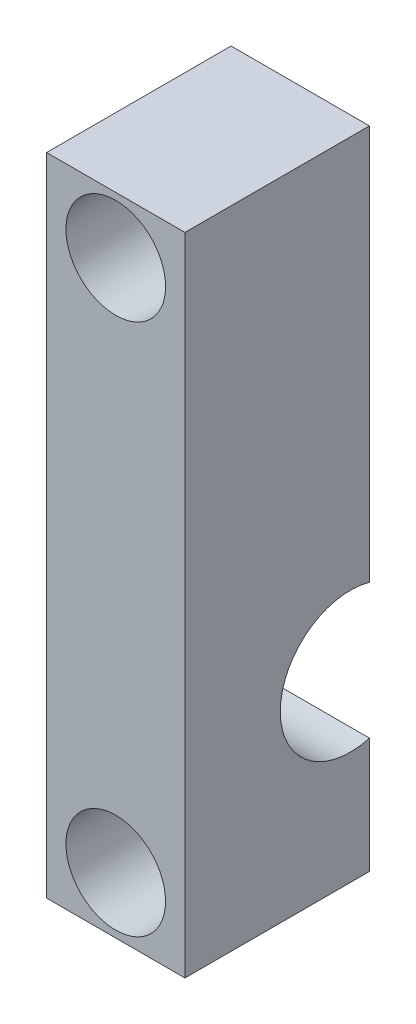
ISO-10303-21;
HEADER;
FILE_DESCRIPTION(('STEP AP214'),'2;1');
FILE_NAME('part.step','',(''),(''),'','','');
FILE_SCHEMA(('AUTOMOTIVE_DESIGN { 1 0 10303 214 1 1 1 1 }'));
ENDSEC;
DATA;
#1=APPLICATION_CONTEXT('core data for automotive mechanical design processes');
#2=APPLICATION_PROTOCOL_DEFINITION('international standard','automotive_design',2000,#1);
#3=PRODUCT_CONTEXT('',#1,'mechanical');
#4=PRODUCT('Part','Part','',(#3));
#5=PRODUCT_RELATED_PRODUCT_CATEGORY('part','',(#4));
#6=PRODUCT_DEFINITION_FORMATION('','',#4);
#7=PRODUCT_DEFINITION_CONTEXT('part definition',#1,'design');
#8=PRODUCT_DEFINITION('design','',#6,#7);
#9=PRODUCT_DEFINITION_SHAPE('','',#8);
#10=(LENGTH_UNIT() NAMED_UNIT(*) SI_UNIT(.MILLI.,.METRE.));
#11=(NAMED_UNIT(*) PLANE_ANGLE_UNIT() SI_UNIT($,.RADIAN.));
#12=(NAMED_UNIT(*) SI_UNIT($,.STERADIAN.) SOLID_ANGLE_UNIT());
#13=UNCERTAINTY_MEASURE_WITH_UNIT(LENGTH_MEASURE(1.E-05),#10,'distance_accuracy_value','');
#14=(GEOMETRIC_REPRESENTATION_CONTEXT(3) GLOBAL_UNCERTAINTY_ASSIGNED_CONTEXT((#13)) GLOBAL_UNIT_ASSIGNED_CONTEXT((#10,
#11,#12)) REPRESENTATION_CONTEXT('',''));
#15=CARTESIAN_POINT('',(0.,0.,0.));
#16=DIRECTION('',(0.,0.,1.));
#17=DIRECTION('',(1.,0.,0.));
#18=AXIS2_PLACEMENT_3D('',#15,#16,#17);
#19=CARTESIAN_POINT('',(0.,0.,0.));
#20=DIRECTION('',(0.,0.,1.));
#21=DIRECTION('',(1.,0.,0.));
#22=AXIS2_PLACEMENT_3D('',#19,#20,#21);
#23=PLANE('',#22);
#24=CARTESIAN_POINT('',(-1.88358565294263,27.116166380399,0.));
#25=DIRECTION('',(0.,0.,1.));
#26=DIRECTION('',(1.,0.,0.));
#27=AXIS2_PLACEMENT_3D('',#24,#25,#26);
#28=CIRCLE('',#27,1.397);
#29=CARTESIAN_POINT('',(-0.486585652942632,27.116166380399,0.));
#30=VERTEX_POINT('',#29);
#31=EDGE_CURVE('E135',#30,#30,#28,.T.);
#32=ORIENTED_EDGE('',*,*,#31,.T.);
#33=EDGE_LOOP('',(#32));
#34=FACE_BOUND('',#33,.T.);
#35=DIRECTION('',(0.,1.,0.));
#36=VECTOR('',#35,1.);
#37=CARTESIAN_POINT('',(2.87891434705736,31.015066380399,0.));
#38=LINE('',#37,#36);
#39=CARTESIAN_POINT('',(2.87891434705737,3.80295097099332,0.));
#40=VERTEX_POINT('',#39);
#41=CARTESIAN_POINT('',(2.87891434705736,31.015066380399,0.));
#42=VERTEX_POINT('',#41);
#43=EDGE_CURVE('E142',#40,#42,#38,.T.);
#44=ORIENTED_EDGE('',*,*,#43,.F.);
#45=DIRECTION('',(-1.,0.,0.));
#46=VECTOR('',#45,1.);
#47=CARTESIAN_POINT('',(2.87891434705737,3.80295097099332,0.));
#48=LINE('',#47,#46);
#49=CARTESIAN_POINT('',(-6.64608565294263,3.80295097099332,0.));
#50=VERTEX_POINT('',#49);
#51=EDGE_CURVE('E50',#40,#50,#48,.T.);
#52=ORIENTED_EDGE('',*,*,#51,.T.);
#53=DIRECTION('',(0.,-1.,0.));
#54=VECTOR('',#53,1.);
#55=CARTESIAN_POINT('',(-6.64608565294264,31.015066380399,0.));
#56=LINE('',#55,#54);
#57=CARTESIAN_POINT('',(-6.64608565294264,31.015066380399,0.));
#58=VERTEX_POINT('',#57);
#59=EDGE_CURVE('E143',#58,#50,#56,.T.);
#60=ORIENTED_EDGE('',*,*,#59,.F.);
#61=DIRECTION('',(-1.,0.,0.));
#62=VECTOR('',#61,1.);
#63=CARTESIAN_POINT('',(-6.64608565294264,31.015066380399,0.));
#64=LINE('',#63,#62);
#65=EDGE_CURVE('E102',#42,#58,#64,.T.);
#66=ORIENTED_EDGE('',*,*,#65,.F.);
#67=EDGE_LOOP('',(#44,#52,#60,#66));
#68=FACE_BOUND('',#67,.T.);
#69=ADVANCED_FACE('F33',(#34,#68),#23,.F.);
#70=CARTESIAN_POINT('',(2.87891434705736,31.015066380399,12.7));
#71=DIRECTION('',(-1.,0.,0.));
#72=DIRECTION('',(0.,-1.,0.));
#73=AXIS2_PLACEMENT_3D('',#70,#71,#72);
#74=PLANE('',#73);
#75=CARTESIAN_POINT('',(2.87891434705737,-13.434933619601,0.));
#76=VERTEX_POINT('',#75);
#77=CARTESIAN_POINT('',(2.87891434705737,-5.48535160929473,0.));
#78=VERTEX_POINT('',#77);
#79=EDGE_CURVE('E37',#76,#78,#38,.T.);
#80=ORIENTED_EDGE('',*,*,#79,.T.);
#81=CARTESIAN_POINT('',(2.87891434705737,-0.8412003191507,1.31230133515652));
#82=DIRECTION('',(-1.,0.,0.));
#83=DIRECTION('',(0.,-1.,0.));
#84=AXIS2_PLACEMENT_3D('',#81,#82,#83);
#85=CIRCLE('',#84,4.826);
#86=EDGE_CURVE('E63',#78,#40,#85,.T.);
#87=ORIENTED_EDGE('',*,*,#86,.T.);
#88=ORIENTED_EDGE('',*,*,#43,.T.);
#89=DIRECTION('',(0.,0.,-1.));
#90=VECTOR('',#89,1.);
#91=CARTESIAN_POINT('',(2.87891434705736,31.015066380399,12.7));
#92=LINE('',#91,#90);
#93=CARTESIAN_POINT('',(2.87891434705736,31.015066380399,12.7));
#94=VERTEX_POINT('',#93);
#95=EDGE_CURVE('E144',#94,#42,#92,.T.);
#96=ORIENTED_EDGE('',*,*,#95,.F.);
#97=DIRECTION('',(0.,1.,0.));
#98=VECTOR('',#97,1.);
#99=CARTESIAN_POINT('',(2.87891434705736,31.015066380399,12.7));
#100=LINE('',#99,#98);
#101=CARTESIAN_POINT('',(2.87891434705737,-13.434933619601,12.7));
#102=VERTEX_POINT('',#101);
#103=EDGE_CURVE('E93',#102,#94,#100,.T.);
#104=ORIENTED_EDGE('',*,*,#103,.F.);
#105=DIRECTION('',(0.,0.,-1.));
#106=VECTOR('',#105,1.);
#107=CARTESIAN_POINT('',(2.87891434705737,-13.434933619601,12.7));
#108=LINE('',#107,#106);
#109=EDGE_CURVE('E146',#102,#76,#108,.T.);
#110=ORIENTED_EDGE('',*,*,#109,.T.);
#111=EDGE_LOOP('',(#80,#87,#88,#96,#104,#110));
#112=FACE_BOUND('',#111,.T.);
#113=ADVANCED_FACE('F35',(#112),#74,.F.);
#114=CARTESIAN_POINT('',(-6.64608565294264,31.015066380399,12.7));
#115=DIRECTION('',(0.,-1.,0.));
#116=DIRECTION('',(1.,0.,0.));
#117=AXIS2_PLACEMENT_3D('',#114,#115,#116);
#118=PLANE('',#117);
#119=ORIENTED_EDGE('',*,*,#65,.T.);
#120=DIRECTION('',(0.,0.,-1.));
#121=VECTOR('',#120,1.);
#122=CARTESIAN_POINT('',(-6.64608565294264,31.015066380399,12.7));
#123=LINE('',#122,#121);
#124=CARTESIAN_POINT('',(-6.64608565294264,31.015066380399,12.7));
#125=VERTEX_POINT('',#124);
#126=EDGE_CURVE('E99',#125,#58,#123,.T.);
#127=ORIENTED_EDGE('',*,*,#126,.F.);
#128=DIRECTION('',(-1.,0.,0.));
#129=VECTOR('',#128,1.);
#130=CARTESIAN_POINT('',(-6.64608565294264,31.015066380399,12.7));
#131=LINE('',#130,#129);
#132=EDGE_CURVE('E86',#94,#125,#131,.T.);
#133=ORIENTED_EDGE('',*,*,#132,.F.);
#134=ORIENTED_EDGE('',*,*,#95,.T.);
#135=EDGE_LOOP('',(#119,#127,#133,#134));
#136=FACE_BOUND('',#135,.T.);
#137=ADVANCED_FACE('F100',(#136),#118,.F.);
#138=CARTESIAN_POINT('',(-6.64608565294264,31.015066380399,12.7));
#139=DIRECTION('',(1.,0.,0.));
#140=DIRECTION('',(0.,1.,0.));
#141=AXIS2_PLACEMENT_3D('',#138,#139,#140);
#142=PLANE('',#141);
#143=ORIENTED_EDGE('',*,*,#59,.T.);
#144=CARTESIAN_POINT('',(-6.64608565294263,-0.841200319150701,1.31230133515652));
#145=DIRECTION('',(-1.,0.,0.));
#146=DIRECTION('',(0.,-1.,0.));
#147=AXIS2_PLACEMENT_3D('',#144,#145,#146);
#148=CIRCLE('',#147,4.826);
#149=CARTESIAN_POINT('',(-6.64608565294263,-5.48535160929473,0.));
#150=VERTEX_POINT('',#149);
#151=EDGE_CURVE('E11',#150,#50,#148,.T.);
#152=ORIENTED_EDGE('',*,*,#151,.F.);
#153=CARTESIAN_POINT('',(-6.64608565294263,-13.434933619601,0.));
#154=VERTEX_POINT('',#153);
#155=EDGE_CURVE('E107',#150,#154,#56,.T.);
#156=ORIENTED_EDGE('',*,*,#155,.T.);
#157=DIRECTION('',(0.,0.,-1.));
#158=VECTOR('',#157,1.);
#159=CARTESIAN_POINT('',(-6.64608565294263,-13.434933619601,12.7));
#160=LINE('',#159,#158);
#161=CARTESIAN_POINT('',(-6.64608565294263,-13.434933619601,12.7));
#162=VERTEX_POINT('',#161);
#163=EDGE_CURVE('E111',#162,#154,#160,.T.);
#164=ORIENTED_EDGE('',*,*,#163,.F.);
#165=DIRECTION('',(0.,-1.,0.));
#166=VECTOR('',#165,1.);
#167=CARTESIAN_POINT('',(-6.64608565294264,31.015066380399,12.7));
#168=LINE('',#167,#166);
#169=EDGE_CURVE('E90',#125,#162,#168,.T.);
#170=ORIENTED_EDGE('',*,*,#169,.F.);
#171=ORIENTED_EDGE('',*,*,#126,.T.);
#172=EDGE_LOOP('',(#143,#152,#156,#164,#170,#171));
#173=FACE_BOUND('',#172,.T.);
#174=ADVANCED_FACE('F109',(#173),#142,.F.);
#175=CARTESIAN_POINT('',(-6.64608565294263,-13.434933619601,12.7));
#176=DIRECTION('',(0.,1.,0.));
#177=DIRECTION('',(0.,0.,1.));
#178=AXIS2_PLACEMENT_3D('',#175,#176,#177);
#179=PLANE('',#178);
#180=DIRECTION('',(1.,0.,0.));
#181=VECTOR('',#180,1.);
#182=CARTESIAN_POINT('',(-6.64608565294263,-13.434933619601,0.));
#183=LINE('',#182,#181);
#184=EDGE_CURVE('E106',#154,#76,#183,.T.);
#185=ORIENTED_EDGE('',*,*,#184,.T.);
#186=ORIENTED_EDGE('',*,*,#109,.F.);
#187=DIRECTION('',(1.,0.,0.));
#188=VECTOR('',#187,1.);
#189=CARTESIAN_POINT('',(-6.64608565294263,-13.434933619601,12.7));
#190=LINE('',#189,#188);
#191=EDGE_CURVE('E113',#162,#102,#190,.T.);
#192=ORIENTED_EDGE('',*,*,#191,.F.);
#193=ORIENTED_EDGE('',*,*,#163,.T.);
#194=EDGE_LOOP('',(#185,#186,#192,#193));
#195=FACE_BOUND('',#194,.T.);
#196=ADVANCED_FACE('F156',(#195),#179,.F.);
#197=CARTESIAN_POINT('',(0.,0.,12.7));
#198=DIRECTION('',(0.,0.,1.));
#199=DIRECTION('',(1.,0.,0.));
#200=AXIS2_PLACEMENT_3D('',#197,#198,#199);
#201=PLANE('',#200);
#202=CARTESIAN_POINT('',(-1.88358565294263,-9.53603361960098,12.7));
#203=DIRECTION('',(0.,0.,1.));
#204=DIRECTION('',(1.,0.,0.));
#205=AXIS2_PLACEMENT_3D('',#202,#203,#204);
#206=CIRCLE('',#205,3.429);
#207=CARTESIAN_POINT('',(1.54541434705737,-9.53603361960098,12.7));
#208=VERTEX_POINT('',#207);
#209=EDGE_CURVE('E126',#208,#208,#206,.T.);
#210=ORIENTED_EDGE('',*,*,#209,.F.);
#211=EDGE_LOOP('',(#210));
#212=FACE_BOUND('',#211,.T.);
#213=CARTESIAN_POINT('',(-1.88358565294263,27.116166380399,12.7));
#214=DIRECTION('',(0.,0.,1.));
#215=DIRECTION('',(1.,0.,0.));
#216=AXIS2_PLACEMENT_3D('',#213,#214,#215);
#217=CIRCLE('',#216,3.429);
#218=CARTESIAN_POINT('',(1.54541434705737,27.116166380399,12.7));
#219=VERTEX_POINT('',#218);
#220=EDGE_CURVE('E120',#219,#219,#217,.T.);
#221=ORIENTED_EDGE('',*,*,#220,.F.);
#222=EDGE_LOOP('',(#221));
#223=FACE_BOUND('',#222,.T.);
#224=ORIENTED_EDGE('',*,*,#103,.T.);
#225=ORIENTED_EDGE('',*,*,#132,.T.);
#226=ORIENTED_EDGE('',*,*,#169,.T.);
#227=ORIENTED_EDGE('',*,*,#191,.T.);
#228=EDGE_LOOP('',(#224,#225,#226,#227));
#229=FACE_BOUND('',#228,.T.);
#230=ADVANCED_FACE('F88',(#212,#223,#229),#201,.T.);
#231=CARTESIAN_POINT('',(-1.88358565294263,-9.53603361960098,0.));
#232=DIRECTION('',(0.,0.,1.));
#233=DIRECTION('',(1.,0.,0.));
#234=AXIS2_PLACEMENT_3D('',#231,#232,#233);
#235=CIRCLE('',#234,1.397);
#236=CARTESIAN_POINT('',(-0.48658565294263,-9.53603361960098,0.));
#237=VERTEX_POINT('',#236);
#238=EDGE_CURVE('E115',#237,#237,#235,.T.);
#239=ORIENTED_EDGE('',*,*,#238,.T.);
#240=EDGE_LOOP('',(#239));
#241=FACE_BOUND('',#240,.T.);
#242=ORIENTED_EDGE('',*,*,#155,.F.);
#243=DIRECTION('',(-1.,0.,0.));
#244=VECTOR('',#243,1.);
#245=CARTESIAN_POINT('',(2.87891434705737,-5.48535160929472,0.));
#246=LINE('',#245,#244);
#247=EDGE_CURVE('E59',#150,#78,#246,.F.);
#248=ORIENTED_EDGE('',*,*,#247,.T.);
#249=ORIENTED_EDGE('',*,*,#79,.F.);
#250=ORIENTED_EDGE('',*,*,#184,.F.);
#251=EDGE_LOOP('',(#242,#248,#249,#250));
#252=FACE_BOUND('',#251,.T.);
#253=ADVANCED_FACE('F162',(#241,#252),#23,.F.);
#254=CARTESIAN_POINT('',(-1.88358565294263,27.116166380399,6.35));
#255=DIRECTION('',(0.,0.,1.));
#256=DIRECTION('',(1.,0.,0.));
#257=AXIS2_PLACEMENT_3D('',#254,#255,#256);
#258=CYLINDRICAL_SURFACE('',#257,3.429);
#259=CARTESIAN_POINT('',(-1.88358565294263,27.116166380399,6.35));
#260=DIRECTION('',(0.,0.,1.));
#261=DIRECTION('',(1.,0.,0.));
#262=AXIS2_PLACEMENT_3D('',#259,#260,#261);
#263=CIRCLE('',#262,3.429);
#264=CARTESIAN_POINT('',(1.54541434705737,27.116166380399,6.35));
#265=VERTEX_POINT('',#264);
#266=EDGE_CURVE('E123',#265,#265,#263,.T.);
#267=ORIENTED_EDGE('',*,*,#266,.F.);
#268=EDGE_LOOP('',(#267));
#269=FACE_BOUND('',#268,.T.);
#270=ORIENTED_EDGE('',*,*,#220,.T.);
#271=EDGE_LOOP('',(#270));
#272=FACE_BOUND('',#271,.T.);
#273=ADVANCED_FACE('F173',(#269,#272),#258,.F.);
#274=CARTESIAN_POINT('',(-1.88358565294263,27.116166380399,6.35));
#275=DIRECTION('',(0.,0.,1.));
#276=DIRECTION('',(1.,0.,0.));
#277=AXIS2_PLACEMENT_3D('',#274,#275,#276);
#278=PLANE('',#277);
#279=CARTESIAN_POINT('',(-1.88358565294263,27.116166380399,6.35));
#280=DIRECTION('',(0.,0.,1.));
#281=DIRECTION('',(1.,0.,0.));
#282=AXIS2_PLACEMENT_3D('',#279,#280,#281);
#283=CIRCLE('',#282,1.397);
#284=CARTESIAN_POINT('',(-0.486585652942632,27.116166380399,6.35));
#285=VERTEX_POINT('',#284);
#286=EDGE_CURVE('E132',#285,#285,#283,.T.);
#287=ORIENTED_EDGE('',*,*,#286,.F.);
#288=EDGE_LOOP('',(#287));
#289=FACE_BOUND('',#288,.T.);
#290=ORIENTED_EDGE('',*,*,#266,.T.);
#291=EDGE_LOOP('',(#290));
#292=FACE_BOUND('',#291,.T.);
#293=ADVANCED_FACE('F179',(#289,#292),#278,.T.);
#294=CARTESIAN_POINT('',(-1.88358565294263,-9.53603361960098,6.35));
#295=DIRECTION('',(0.,0.,1.));
#296=DIRECTION('',(1.,0.,0.));
#297=AXIS2_PLACEMENT_3D('',#294,#295,#296);
#298=CYLINDRICAL_SURFACE('',#297,3.429);
#299=CARTESIAN_POINT('',(-1.88358565294263,-9.53603361960098,6.35));
#300=DIRECTION('',(0.,0.,1.));
#301=DIRECTION('',(1.,0.,0.));
#302=AXIS2_PLACEMENT_3D('',#299,#300,#301);
#303=CIRCLE('',#302,3.429);
#304=CARTESIAN_POINT('',(1.54541434705737,-9.53603361960098,6.35));
#305=VERTEX_POINT('',#304);
#306=EDGE_CURVE('E129',#305,#305,#303,.T.);
#307=ORIENTED_EDGE('',*,*,#306,.F.);
#308=EDGE_LOOP('',(#307));
#309=FACE_BOUND('',#308,.T.);
#310=ORIENTED_EDGE('',*,*,#209,.T.);
#311=EDGE_LOOP('',(#310));
#312=FACE_BOUND('',#311,.T.);
#313=ADVANCED_FACE('F197',(#309,#312),#298,.F.);
#314=CARTESIAN_POINT('',(-1.88358565294263,-9.53603361960098,6.35));
#315=DIRECTION('',(0.,0.,1.));
#316=DIRECTION('',(1.,0.,0.));
#317=AXIS2_PLACEMENT_3D('',#314,#315,#316);
#318=PLANE('',#317);
#319=CARTESIAN_POINT('',(-1.88358565294263,-9.53603361960098,6.35));
#320=DIRECTION('',(0.,0.,1.));
#321=DIRECTION('',(1.,0.,0.));
#322=AXIS2_PLACEMENT_3D('',#319,#320,#321);
#323=CIRCLE('',#322,1.397);
#324=CARTESIAN_POINT('',(-0.48658565294263,-9.53603361960098,6.35));
#325=VERTEX_POINT('',#324);
#326=EDGE_CURVE('E43',#325,#325,#323,.T.);
#327=ORIENTED_EDGE('',*,*,#326,.F.);
#328=EDGE_LOOP('',(#327));
#329=FACE_BOUND('',#328,.T.);
#330=ORIENTED_EDGE('',*,*,#306,.T.);
#331=EDGE_LOOP('',(#330));
#332=FACE_BOUND('',#331,.T.);
#333=ADVANCED_FACE('F194',(#329,#332),#318,.T.);
#334=CARTESIAN_POINT('',(-1.88358565294263,27.116166380399,0.));
#335=DIRECTION('',(0.,0.,1.));
#336=DIRECTION('',(1.,0.,0.));
#337=AXIS2_PLACEMENT_3D('',#334,#335,#336);
#338=CYLINDRICAL_SURFACE('',#337,1.397);
#339=ORIENTED_EDGE('',*,*,#31,.F.);
#340=EDGE_LOOP('',(#339));
#341=FACE_BOUND('',#340,.T.);
#342=ORIENTED_EDGE('',*,*,#286,.T.);
#343=EDGE_LOOP('',(#342));
#344=FACE_BOUND('',#343,.T.);
#345=ADVANCED_FACE('F190',(#341,#344),#338,.F.);
#346=CARTESIAN_POINT('',(-1.88358565294263,-9.53603361960098,0.));
#347=DIRECTION('',(0.,0.,1.));
#348=DIRECTION('',(1.,0.,0.));
#349=AXIS2_PLACEMENT_3D('',#346,#347,#348);
#350=CYLINDRICAL_SURFACE('',#349,1.397);
#351=ORIENTED_EDGE('',*,*,#238,.F.);
#352=EDGE_LOOP('',(#351));
#353=FACE_BOUND('',#352,.T.);
#354=ORIENTED_EDGE('',*,*,#326,.T.);
#355=EDGE_LOOP('',(#354));
#356=FACE_BOUND('',#355,.T.);
#357=ADVANCED_FACE('F186',(#353,#356),#350,.F.);
#358=CARTESIAN_POINT('',(2.87891434705737,-0.8412003191507,1.31230133515652));
#359=DIRECTION('',(-1.,0.,0.));
#360=DIRECTION('',(0.,-1.,0.));
#361=AXIS2_PLACEMENT_3D('',#358,#359,#360);
#362=CYLINDRICAL_SURFACE('',#361,4.826);
#363=ORIENTED_EDGE('',*,*,#86,.F.);
#364=ORIENTED_EDGE('',*,*,#247,.F.);
#365=ORIENTED_EDGE('',*,*,#151,.T.);
#366=ORIENTED_EDGE('',*,*,#51,.F.);
#367=EDGE_LOOP('',(#363,#364,#365,#366));
#368=FACE_BOUND('',#367,.T.);
#369=ADVANCED_FACE('F189',(#368),#362,.F.);
#370=CLOSED_SHELL('',(#69,#113,#137,#174,#196,#230,#253,#273,#293,#313,#333,#345,#357,#369));
#371=MANIFOLD_SOLID_BREP('B2',#370);
#372=ADVANCED_BREP_SHAPE_REPRESENTATION('',(#18,#371),#14);
#373=SHAPE_DEFINITION_REPRESENTATION(#9,#372);
ENDSEC;
END-ISO-10303-21;
